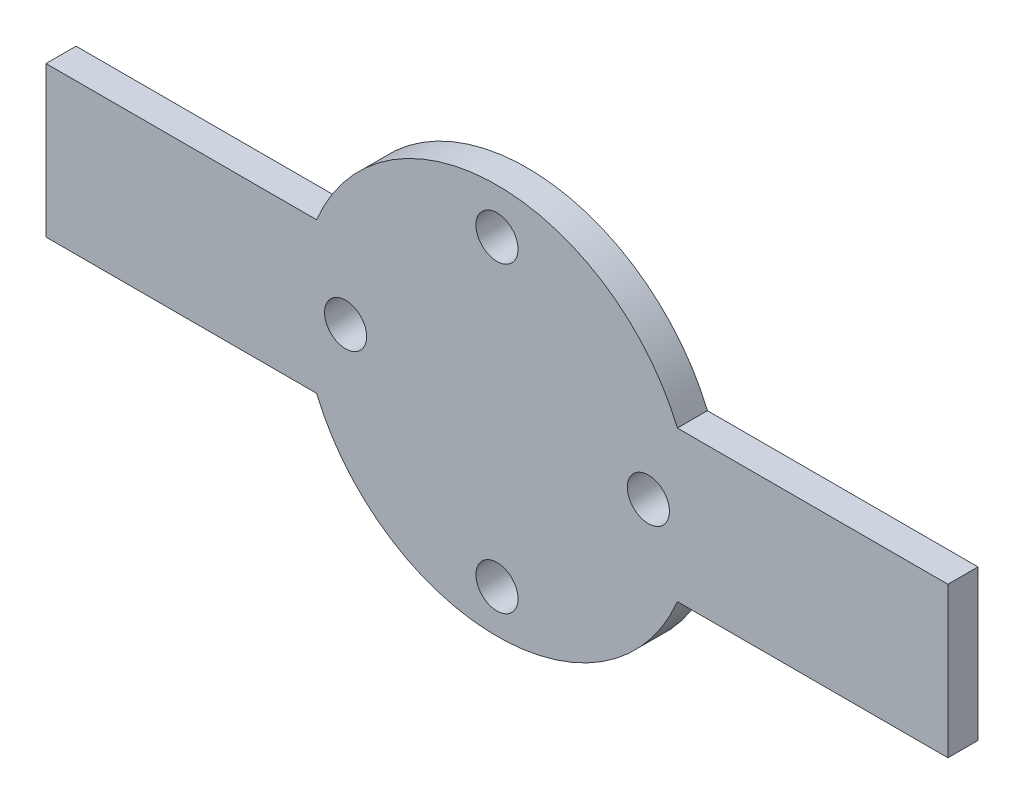
ISO-10303-21;
HEADER;
FILE_DESCRIPTION(('STEP AP214'),'2;1');
FILE_NAME('part.step','',(''),(''),'','','');
FILE_SCHEMA(('AUTOMOTIVE_DESIGN { 1 0 10303 214 1 1 1 1 }'));
ENDSEC;
DATA;
#1=APPLICATION_CONTEXT('core data for automotive mechanical design processes');
#2=APPLICATION_PROTOCOL_DEFINITION('international standard','automotive_design',2000,#1);
#3=PRODUCT_CONTEXT('',#1,'mechanical');
#4=PRODUCT('Part','Part','',(#3));
#5=PRODUCT_RELATED_PRODUCT_CATEGORY('part','',(#4));
#6=PRODUCT_DEFINITION_FORMATION('','',#4);
#7=PRODUCT_DEFINITION_CONTEXT('part definition',#1,'design');
#8=PRODUCT_DEFINITION('design','',#6,#7);
#9=PRODUCT_DEFINITION_SHAPE('','',#8);
#10=(LENGTH_UNIT() NAMED_UNIT(*) SI_UNIT(.MILLI.,.METRE.));
#11=(NAMED_UNIT(*) PLANE_ANGLE_UNIT() SI_UNIT($,.RADIAN.));
#12=(NAMED_UNIT(*) SI_UNIT($,.STERADIAN.) SOLID_ANGLE_UNIT());
#13=UNCERTAINTY_MEASURE_WITH_UNIT(LENGTH_MEASURE(1.E-05),#10,'distance_accuracy_value','');
#14=(GEOMETRIC_REPRESENTATION_CONTEXT(3) GLOBAL_UNCERTAINTY_ASSIGNED_CONTEXT((#13)) GLOBAL_UNIT_ASSIGNED_CONTEXT((#10,
#11,#12)) REPRESENTATION_CONTEXT('',''));
#15=CARTESIAN_POINT('',(0.,0.,0.));
#16=DIRECTION('',(0.,0.,1.));
#17=DIRECTION('',(1.,0.,0.));
#18=AXIS2_PLACEMENT_3D('',#15,#16,#17);
#19=CARTESIAN_POINT('',(0.,0.,5.));
#20=DIRECTION('',(0.,0.,-1.));
#21=DIRECTION('',(-1.,0.,0.));
#22=AXIS2_PLACEMENT_3D('',#19,#20,#21);
#23=CYLINDRICAL_SURFACE('',#22,32.5);
#24=CARTESIAN_POINT('',(0.,0.,5.));
#25=DIRECTION('',(0.,0.,1.));
#26=DIRECTION('',(1.,0.,0.));
#27=AXIS2_PLACEMENT_3D('',#24,#25,#26);
#28=CIRCLE('',#27,32.5);
#29=CARTESIAN_POINT('',(-30.,-12.5,5.));
#30=VERTEX_POINT('',#29);
#31=CARTESIAN_POINT('',(30.,-12.5,5.));
#32=VERTEX_POINT('',#31);
#33=EDGE_CURVE('E42',#30,#32,#28,.T.);
#34=ORIENTED_EDGE('',*,*,#33,.F.);
#35=DIRECTION('',(0.,0.,-1.));
#36=VECTOR('',#35,1.);
#37=CARTESIAN_POINT('',(-30.,-12.5,5.));
#38=LINE('',#37,#36);
#39=CARTESIAN_POINT('',(-30.,-12.5,0.));
#40=VERTEX_POINT('',#39);
#41=EDGE_CURVE('E157',#30,#40,#38,.T.);
#42=ORIENTED_EDGE('',*,*,#41,.T.);
#43=CARTESIAN_POINT('',(0.,0.,0.));
#44=DIRECTION('',(0.,0.,1.));
#45=DIRECTION('',(1.,0.,0.));
#46=AXIS2_PLACEMENT_3D('',#43,#44,#45);
#47=CIRCLE('',#46,32.5);
#48=CARTESIAN_POINT('',(30.,-12.5,0.));
#49=VERTEX_POINT('',#48);
#50=EDGE_CURVE('E164',#40,#49,#47,.T.);
#51=ORIENTED_EDGE('',*,*,#50,.T.);
#52=DIRECTION('',(0.,0.,-1.));
#53=VECTOR('',#52,1.);
#54=CARTESIAN_POINT('',(30.,-12.5,5.));
#55=LINE('',#54,#53);
#56=EDGE_CURVE('E49',#49,#32,#55,.F.);
#57=ORIENTED_EDGE('',*,*,#56,.T.);
#58=EDGE_LOOP('',(#34,#42,#51,#57));
#59=FACE_BOUND('',#58,.T.);
#60=ADVANCED_FACE('F33',(#59),#23,.T.);
#61=CARTESIAN_POINT('',(30.,12.5,5.));
#62=VERTEX_POINT('',#61);
#63=CARTESIAN_POINT('',(-30.,12.5,5.));
#64=VERTEX_POINT('',#63);
#65=EDGE_CURVE('E11',#62,#64,#28,.T.);
#66=ORIENTED_EDGE('',*,*,#65,.F.);
#67=DIRECTION('',(0.,0.,-1.));
#68=VECTOR('',#67,1.);
#69=CARTESIAN_POINT('',(30.,12.5,5.));
#70=LINE('',#69,#68);
#71=CARTESIAN_POINT('',(30.,12.5,0.));
#72=VERTEX_POINT('',#71);
#73=EDGE_CURVE('E153',#62,#72,#70,.T.);
#74=ORIENTED_EDGE('',*,*,#73,.T.);
#75=CARTESIAN_POINT('',(-30.,12.5,0.));
#76=VERTEX_POINT('',#75);
#77=EDGE_CURVE('E37',#72,#76,#47,.T.);
#78=ORIENTED_EDGE('',*,*,#77,.T.);
#79=DIRECTION('',(0.,0.,-1.));
#80=VECTOR('',#79,1.);
#81=CARTESIAN_POINT('',(-30.,12.5,5.));
#82=LINE('',#81,#80);
#83=EDGE_CURVE('E147',#76,#64,#82,.F.);
#84=ORIENTED_EDGE('',*,*,#83,.T.);
#85=EDGE_LOOP('',(#66,#74,#78,#84));
#86=FACE_BOUND('',#85,.T.);
#87=ADVANCED_FACE('F35',(#86),#23,.T.);
#88=CARTESIAN_POINT('',(0.,0.,5.));
#89=DIRECTION('',(0.,0.,1.));
#90=DIRECTION('',(1.,0.,0.));
#91=AXIS2_PLACEMENT_3D('',#88,#89,#90);
#92=PLANE('',#91);
#93=CARTESIAN_POINT('',(25.1766697400168,-0.176669740016903,5.));
#94=DIRECTION('',(0.,0.,1.));
#95=DIRECTION('',(1.,0.,0.));
#96=AXIS2_PLACEMENT_3D('',#93,#94,#95);
#97=CIRCLE('',#96,3.5);
#98=CARTESIAN_POINT('',(28.6766697400168,-0.176669740016903,5.));
#99=VERTEX_POINT('',#98);
#100=EDGE_CURVE('E131',#99,#99,#97,.T.);
#101=ORIENTED_EDGE('',*,*,#100,.F.);
#102=EDGE_LOOP('',(#101));
#103=FACE_BOUND('',#102,.T.);
#104=CARTESIAN_POINT('',(0.,-25.3533394800337,5.));
#105=DIRECTION('',(0.,0.,1.));
#106=DIRECTION('',(1.,0.,0.));
#107=AXIS2_PLACEMENT_3D('',#104,#105,#106);
#108=CIRCLE('',#107,3.5);
#109=CARTESIAN_POINT('',(3.50000000000003,-25.3533394800337,5.));
#110=VERTEX_POINT('',#109);
#111=EDGE_CURVE('E235',#110,#110,#108,.T.);
#112=ORIENTED_EDGE('',*,*,#111,.F.);
#113=EDGE_LOOP('',(#112));
#114=FACE_BOUND('',#113,.T.);
#115=CARTESIAN_POINT('',(-25.1766697400168,-0.176669740016578,5.));
#116=DIRECTION('',(0.,0.,1.));
#117=DIRECTION('',(1.,0.,0.));
#118=AXIS2_PLACEMENT_3D('',#115,#116,#117);
#119=CIRCLE('',#118,3.5);
#120=CARTESIAN_POINT('',(-21.6766697400168,-0.176669740016578,5.));
#121=VERTEX_POINT('',#120);
#122=EDGE_CURVE('E231',#121,#121,#119,.T.);
#123=ORIENTED_EDGE('',*,*,#122,.F.);
#124=EDGE_LOOP('',(#123));
#125=FACE_BOUND('',#124,.T.);
#126=ORIENTED_EDGE('',*,*,#65,.T.);
#127=DIRECTION('',(1.,0.,0.));
#128=VECTOR('',#127,1.);
#129=CARTESIAN_POINT('',(75.,12.5,5.));
#130=LINE('',#129,#128);
#131=CARTESIAN_POINT('',(-75.,12.5,5.));
#132=VERTEX_POINT('',#131);
#133=EDGE_CURVE('E101',#132,#64,#130,.T.);
#134=ORIENTED_EDGE('',*,*,#133,.F.);
#135=DIRECTION('',(0.,1.,0.));
#136=VECTOR('',#135,1.);
#137=CARTESIAN_POINT('',(-75.,12.5,5.));
#138=LINE('',#137,#136);
#139=CARTESIAN_POINT('',(-75.,-12.5,5.));
#140=VERTEX_POINT('',#139);
#141=EDGE_CURVE('E116',#140,#132,#138,.T.);
#142=ORIENTED_EDGE('',*,*,#141,.F.);
#143=DIRECTION('',(-1.,0.,0.));
#144=VECTOR('',#143,1.);
#145=CARTESIAN_POINT('',(75.,-12.5,5.));
#146=LINE('',#145,#144);
#147=EDGE_CURVE('E136',#30,#140,#146,.T.);
#148=ORIENTED_EDGE('',*,*,#147,.F.);
#149=ORIENTED_EDGE('',*,*,#33,.T.);
#150=CARTESIAN_POINT('',(75.,-12.5,5.));
#151=VERTEX_POINT('',#150);
#152=EDGE_CURVE('E109',#151,#32,#146,.T.);
#153=ORIENTED_EDGE('',*,*,#152,.F.);
#154=DIRECTION('',(0.,-1.,0.));
#155=VECTOR('',#154,1.);
#156=CARTESIAN_POINT('',(75.,12.5,5.));
#157=LINE('',#156,#155);
#158=CARTESIAN_POINT('',(75.,12.5,5.));
#159=VERTEX_POINT('',#158);
#160=EDGE_CURVE('E118',#159,#151,#157,.T.);
#161=ORIENTED_EDGE('',*,*,#160,.F.);
#162=EDGE_CURVE('E119',#62,#159,#130,.T.);
#163=ORIENTED_EDGE('',*,*,#162,.F.);
#164=EDGE_LOOP('',(#126,#134,#142,#148,#149,#153,#161,#163));
#165=FACE_BOUND('',#164,.T.);
#166=CARTESIAN_POINT('',(0.,25.,5.));
#167=DIRECTION('',(0.,0.,1.));
#168=DIRECTION('',(1.,0.,0.));
#169=AXIS2_PLACEMENT_3D('',#166,#167,#168);
#170=CIRCLE('',#169,3.5);
#171=CARTESIAN_POINT('',(3.5,25.,5.));
#172=VERTEX_POINT('',#171);
#173=EDGE_CURVE('E162',#172,#172,#170,.T.);
#174=ORIENTED_EDGE('',*,*,#173,.F.);
#175=EDGE_LOOP('',(#174));
#176=FACE_BOUND('',#175,.T.);
#177=ADVANCED_FACE('F113',(#103,#114,#125,#165,#176),#92,.T.);
#178=CARTESIAN_POINT('',(0.,0.,0.));
#179=DIRECTION('',(0.,0.,1.));
#180=DIRECTION('',(1.,0.,0.));
#181=AXIS2_PLACEMENT_3D('',#178,#179,#180);
#182=PLANE('',#181);
#183=CARTESIAN_POINT('',(25.1766697400168,-0.176669740016903,0.));
#184=DIRECTION('',(0.,0.,-1.));
#185=DIRECTION('',(0.,1.,0.));
#186=AXIS2_PLACEMENT_3D('',#183,#184,#185);
#187=CIRCLE('',#186,3.5);
#188=CARTESIAN_POINT('',(25.1766697400169,3.3233302599831,0.));
#189=VERTEX_POINT('',#188);
#190=EDGE_CURVE('E230',#189,#189,#187,.T.);
#191=ORIENTED_EDGE('',*,*,#190,.F.);
#192=EDGE_LOOP('',(#191));
#193=FACE_BOUND('',#192,.T.);
#194=CARTESIAN_POINT('',(0.,-25.3533394800337,0.));
#195=DIRECTION('',(0.,0.,-1.));
#196=DIRECTION('',(1.,0.,0.));
#197=AXIS2_PLACEMENT_3D('',#194,#195,#196);
#198=CIRCLE('',#197,3.5);
#199=CARTESIAN_POINT('',(3.50000000000003,-25.3533394800337,0.));
#200=VERTEX_POINT('',#199);
#201=EDGE_CURVE('E232',#200,#200,#198,.T.);
#202=ORIENTED_EDGE('',*,*,#201,.F.);
#203=EDGE_LOOP('',(#202));
#204=FACE_BOUND('',#203,.T.);
#205=CARTESIAN_POINT('',(-25.1766697400168,-0.176669740016578,0.));
#206=DIRECTION('',(0.,0.,-1.));
#207=DIRECTION('',(0.,-1.,0.));
#208=AXIS2_PLACEMENT_3D('',#205,#206,#207);
#209=CIRCLE('',#208,3.5);
#210=CARTESIAN_POINT('',(-25.1766697400169,-3.67666974001658,0.));
#211=VERTEX_POINT('',#210);
#212=EDGE_CURVE('E238',#211,#211,#209,.T.);
#213=ORIENTED_EDGE('',*,*,#212,.F.);
#214=EDGE_LOOP('',(#213));
#215=FACE_BOUND('',#214,.T.);
#216=CARTESIAN_POINT('',(0.,25.,0.));
#217=DIRECTION('',(0.,0.,-1.));
#218=DIRECTION('',(-1.,0.,0.));
#219=AXIS2_PLACEMENT_3D('',#216,#217,#218);
#220=CIRCLE('',#219,3.5);
#221=CARTESIAN_POINT('',(-3.5,25.,0.));
#222=VERTEX_POINT('',#221);
#223=EDGE_CURVE('E159',#222,#222,#220,.T.);
#224=ORIENTED_EDGE('',*,*,#223,.F.);
#225=EDGE_LOOP('',(#224));
#226=FACE_BOUND('',#225,.T.);
#227=ORIENTED_EDGE('',*,*,#77,.F.);
#228=DIRECTION('',(1.,0.,0.));
#229=VECTOR('',#228,1.);
#230=CARTESIAN_POINT('',(75.,12.5,0.));
#231=LINE('',#230,#229);
#232=CARTESIAN_POINT('',(75.,12.5,0.));
#233=VERTEX_POINT('',#232);
#234=EDGE_CURVE('E141',#72,#233,#231,.T.);
#235=ORIENTED_EDGE('',*,*,#234,.T.);
#236=DIRECTION('',(0.,-1.,0.));
#237=VECTOR('',#236,1.);
#238=CARTESIAN_POINT('',(75.,12.5,0.));
#239=LINE('',#238,#237);
#240=CARTESIAN_POINT('',(75.,-12.5,0.));
#241=VERTEX_POINT('',#240);
#242=EDGE_CURVE('E143',#233,#241,#239,.T.);
#243=ORIENTED_EDGE('',*,*,#242,.T.);
#244=DIRECTION('',(-1.,0.,0.));
#245=VECTOR('',#244,1.);
#246=CARTESIAN_POINT('',(75.,-12.5,0.));
#247=LINE('',#246,#245);
#248=EDGE_CURVE('E125',#241,#49,#247,.T.);
#249=ORIENTED_EDGE('',*,*,#248,.T.);
#250=ORIENTED_EDGE('',*,*,#50,.F.);
#251=CARTESIAN_POINT('',(-75.,-12.5,0.));
#252=VERTEX_POINT('',#251);
#253=EDGE_CURVE('E128',#40,#252,#247,.T.);
#254=ORIENTED_EDGE('',*,*,#253,.T.);
#255=DIRECTION('',(0.,1.,0.));
#256=VECTOR('',#255,1.);
#257=CARTESIAN_POINT('',(-75.,12.5,0.));
#258=LINE('',#257,#256);
#259=CARTESIAN_POINT('',(-75.,12.5,0.));
#260=VERTEX_POINT('',#259);
#261=EDGE_CURVE('E139',#252,#260,#258,.T.);
#262=ORIENTED_EDGE('',*,*,#261,.T.);
#263=EDGE_CURVE('E103',#260,#76,#231,.T.);
#264=ORIENTED_EDGE('',*,*,#263,.T.);
#265=EDGE_LOOP('',(#227,#235,#243,#249,#250,#254,#262,#264));
#266=FACE_BOUND('',#265,.T.);
#267=ADVANCED_FACE('F182',(#193,#204,#215,#226,#266),#182,.F.);
#268=CARTESIAN_POINT('',(0.,25.,10.));
#269=DIRECTION('',(0.,0.,-1.));
#270=DIRECTION('',(-1.,0.,0.));
#271=AXIS2_PLACEMENT_3D('',#268,#269,#270);
#272=CYLINDRICAL_SURFACE('',#271,3.5);
#273=ORIENTED_EDGE('',*,*,#173,.T.);
#274=EDGE_LOOP('',(#273));
#275=FACE_BOUND('',#274,.T.);
#276=ORIENTED_EDGE('',*,*,#223,.T.);
#277=EDGE_LOOP('',(#276));
#278=FACE_BOUND('',#277,.T.);
#279=ADVANCED_FACE('F198',(#275,#278),#272,.F.);
#280=CARTESIAN_POINT('',(-75.,12.5,5.));
#281=DIRECTION('',(-1.,0.,0.));
#282=DIRECTION('',(0.,0.,1.));
#283=AXIS2_PLACEMENT_3D('',#280,#281,#282);
#284=PLANE('',#283);
#285=ORIENTED_EDGE('',*,*,#261,.F.);
#286=DIRECTION('',(0.,0.,-1.));
#287=VECTOR('',#286,1.);
#288=CARTESIAN_POINT('',(-75.,-12.5,5.));
#289=LINE('',#288,#287);
#290=EDGE_CURVE('E124',#140,#252,#289,.T.);
#291=ORIENTED_EDGE('',*,*,#290,.F.);
#292=ORIENTED_EDGE('',*,*,#141,.T.);
#293=DIRECTION('',(0.,0.,-1.));
#294=VECTOR('',#293,1.);
#295=CARTESIAN_POINT('',(-75.,12.5,5.));
#296=LINE('',#295,#294);
#297=EDGE_CURVE('E97',#132,#260,#296,.T.);
#298=ORIENTED_EDGE('',*,*,#297,.T.);
#299=EDGE_LOOP('',(#285,#291,#292,#298));
#300=FACE_BOUND('',#299,.T.);
#301=ADVANCED_FACE('F122',(#300),#284,.T.);
#302=CARTESIAN_POINT('',(75.,12.5,5.));
#303=DIRECTION('',(0.,1.,0.));
#304=DIRECTION('',(0.,0.,1.));
#305=AXIS2_PLACEMENT_3D('',#302,#303,#304);
#306=PLANE('',#305);
#307=ORIENTED_EDGE('',*,*,#83,.F.);
#308=ORIENTED_EDGE('',*,*,#263,.F.);
#309=ORIENTED_EDGE('',*,*,#297,.F.);
#310=ORIENTED_EDGE('',*,*,#133,.T.);
#311=EDGE_LOOP('',(#307,#308,#309,#310));
#312=FACE_BOUND('',#311,.T.);
#313=ADVANCED_FACE('F100',(#312),#306,.T.);
#314=CARTESIAN_POINT('',(75.,-12.5,5.));
#315=DIRECTION('',(0.,-1.,0.));
#316=DIRECTION('',(0.,0.,-1.));
#317=AXIS2_PLACEMENT_3D('',#314,#315,#316);
#318=PLANE('',#317);
#319=ORIENTED_EDGE('',*,*,#41,.F.);
#320=ORIENTED_EDGE('',*,*,#147,.T.);
#321=ORIENTED_EDGE('',*,*,#290,.T.);
#322=ORIENTED_EDGE('',*,*,#253,.F.);
#323=EDGE_LOOP('',(#319,#320,#321,#322));
#324=FACE_BOUND('',#323,.T.);
#325=ADVANCED_FACE('F185',(#324),#318,.T.);
#326=ORIENTED_EDGE('',*,*,#56,.F.);
#327=ORIENTED_EDGE('',*,*,#248,.F.);
#328=DIRECTION('',(0.,0.,-1.));
#329=VECTOR('',#328,1.);
#330=CARTESIAN_POINT('',(75.,-12.5,5.));
#331=LINE('',#330,#329);
#332=EDGE_CURVE('E148',#151,#241,#331,.T.);
#333=ORIENTED_EDGE('',*,*,#332,.F.);
#334=ORIENTED_EDGE('',*,*,#152,.T.);
#335=EDGE_LOOP('',(#326,#327,#333,#334));
#336=FACE_BOUND('',#335,.T.);
#337=ADVANCED_FACE('F171',(#336),#318,.T.);
#338=ORIENTED_EDGE('',*,*,#73,.F.);
#339=ORIENTED_EDGE('',*,*,#162,.T.);
#340=DIRECTION('',(0.,0.,-1.));
#341=VECTOR('',#340,1.);
#342=CARTESIAN_POINT('',(75.,12.5,5.));
#343=LINE('',#342,#341);
#344=EDGE_CURVE('E108',#159,#233,#343,.T.);
#345=ORIENTED_EDGE('',*,*,#344,.T.);
#346=ORIENTED_EDGE('',*,*,#234,.F.);
#347=EDGE_LOOP('',(#338,#339,#345,#346));
#348=FACE_BOUND('',#347,.T.);
#349=ADVANCED_FACE('F179',(#348),#306,.T.);
#350=CARTESIAN_POINT('',(75.,12.5,5.));
#351=DIRECTION('',(1.,0.,0.));
#352=DIRECTION('',(0.,0.,-1.));
#353=AXIS2_PLACEMENT_3D('',#350,#351,#352);
#354=PLANE('',#353);
#355=ORIENTED_EDGE('',*,*,#242,.F.);
#356=ORIENTED_EDGE('',*,*,#344,.F.);
#357=ORIENTED_EDGE('',*,*,#160,.T.);
#358=ORIENTED_EDGE('',*,*,#332,.T.);
#359=EDGE_LOOP('',(#355,#356,#357,#358));
#360=FACE_BOUND('',#359,.T.);
#361=ADVANCED_FACE('F176',(#360),#354,.T.);
#362=CARTESIAN_POINT('',(-25.1766697400168,-0.176669740016578,10.));
#363=DIRECTION('',(0.,0.,-1.));
#364=DIRECTION('',(-1.,0.,0.));
#365=AXIS2_PLACEMENT_3D('',#362,#363,#364);
#366=CYLINDRICAL_SURFACE('',#365,3.5);
#367=ORIENTED_EDGE('',*,*,#122,.T.);
#368=EDGE_LOOP('',(#367));
#369=FACE_BOUND('',#368,.T.);
#370=ORIENTED_EDGE('',*,*,#212,.T.);
#371=EDGE_LOOP('',(#370));
#372=FACE_BOUND('',#371,.T.);
#373=ADVANCED_FACE('F211',(#369,#372),#366,.F.);
#374=CARTESIAN_POINT('',(0.,-25.3533394800337,10.));
#375=DIRECTION('',(0.,0.,-1.));
#376=DIRECTION('',(-1.,0.,0.));
#377=AXIS2_PLACEMENT_3D('',#374,#375,#376);
#378=CYLINDRICAL_SURFACE('',#377,3.5);
#379=ORIENTED_EDGE('',*,*,#111,.T.);
#380=EDGE_LOOP('',(#379));
#381=FACE_BOUND('',#380,.T.);
#382=ORIENTED_EDGE('',*,*,#201,.T.);
#383=EDGE_LOOP('',(#382));
#384=FACE_BOUND('',#383,.T.);
#385=ADVANCED_FACE('F216',(#381,#384),#378,.F.);
#386=CARTESIAN_POINT('',(25.1766697400168,-0.176669740016903,10.));
#387=DIRECTION('',(0.,0.,-1.));
#388=DIRECTION('',(-1.,0.,0.));
#389=AXIS2_PLACEMENT_3D('',#386,#387,#388);
#390=CYLINDRICAL_SURFACE('',#389,3.5);
#391=ORIENTED_EDGE('',*,*,#100,.T.);
#392=EDGE_LOOP('',(#391));
#393=FACE_BOUND('',#392,.T.);
#394=ORIENTED_EDGE('',*,*,#190,.T.);
#395=EDGE_LOOP('',(#394));
#396=FACE_BOUND('',#395,.T.);
#397=ADVANCED_FACE('F220',(#393,#396),#390,.F.);
#398=CLOSED_SHELL('',(#60,#87,#177,#267,#279,#301,#313,#325,#337,#349,#361,#373,#385,#397));
#399=MANIFOLD_SOLID_BREP('B2',#398);
#400=ADVANCED_BREP_SHAPE_REPRESENTATION('',(#18,#399),#14);
#401=SHAPE_DEFINITION_REPRESENTATION(#9,#400);
ENDSEC;
END-ISO-10303-21;
